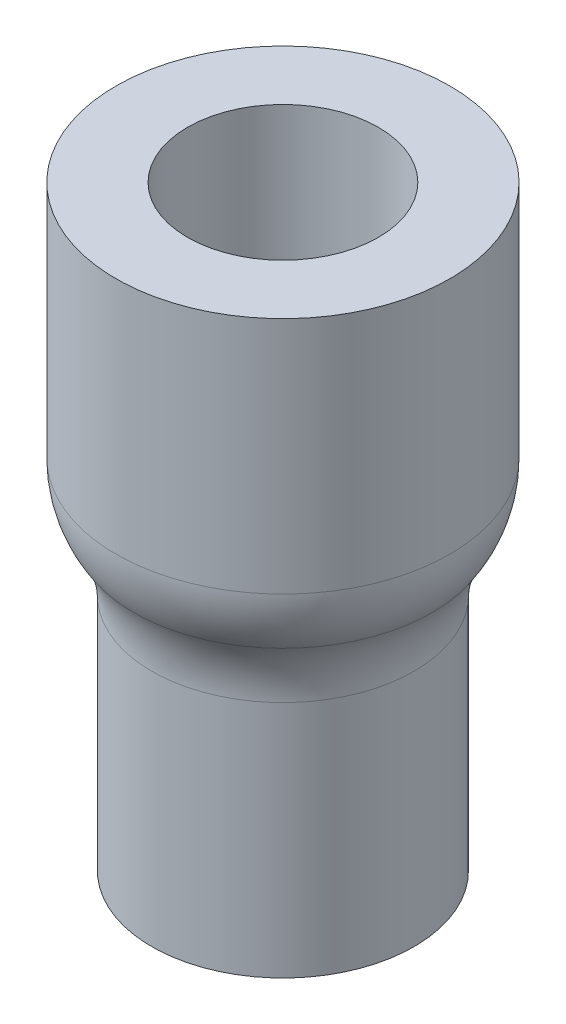
ISO-10303-21;
HEADER;
FILE_DESCRIPTION(('STEP AP214'),'2;1');
FILE_NAME('part.step','',(''),(''),'','','');
FILE_SCHEMA(('AUTOMOTIVE_DESIGN { 1 0 10303 214 1 1 1 1 }'));
ENDSEC;
DATA;
#1=APPLICATION_CONTEXT('core data for automotive mechanical design processes');
#2=APPLICATION_PROTOCOL_DEFINITION('international standard','automotive_design',2000,#1);
#3=PRODUCT_CONTEXT('',#1,'mechanical');
#4=PRODUCT('Part','Part','',(#3));
#5=PRODUCT_RELATED_PRODUCT_CATEGORY('part','',(#4));
#6=PRODUCT_DEFINITION_FORMATION('','',#4);
#7=PRODUCT_DEFINITION_CONTEXT('part definition',#1,'design');
#8=PRODUCT_DEFINITION('design','',#6,#7);
#9=PRODUCT_DEFINITION_SHAPE('','',#8);
#10=(LENGTH_UNIT() NAMED_UNIT(*) SI_UNIT(.MILLI.,.METRE.));
#11=(NAMED_UNIT(*) PLANE_ANGLE_UNIT() SI_UNIT($,.RADIAN.));
#12=(NAMED_UNIT(*) SI_UNIT($,.STERADIAN.) SOLID_ANGLE_UNIT());
#13=UNCERTAINTY_MEASURE_WITH_UNIT(LENGTH_MEASURE(1.E-05),#10,'distance_accuracy_value','');
#14=(GEOMETRIC_REPRESENTATION_CONTEXT(3) GLOBAL_UNCERTAINTY_ASSIGNED_CONTEXT((#13)) GLOBAL_UNIT_ASSIGNED_CONTEXT((#10,
#11,#12)) REPRESENTATION_CONTEXT('',''));
#15=CARTESIAN_POINT('',(0.,0.,0.));
#16=DIRECTION('',(0.,0.,1.));
#17=DIRECTION('',(1.,0.,0.));
#18=AXIS2_PLACEMENT_3D('',#15,#16,#17);
#19=CARTESIAN_POINT('',(5.5,0.,0.));
#20=DIRECTION('',(0.,-1.,0.));
#21=DIRECTION('',(0.,0.,-1.));
#22=AXIS2_PLACEMENT_3D('',#19,#20,#21);
#23=PLANE('',#22);
#24=CARTESIAN_POINT('',(0.,0.,0.));
#25=DIRECTION('',(0.,-1.,0.));
#26=DIRECTION('',(0.,0.,-1.));
#27=AXIS2_PLACEMENT_3D('',#24,#25,#26);
#28=CIRCLE('',#27,5.5);
#29=CARTESIAN_POINT('',(0.,0.,-5.5));
#30=VERTEX_POINT('',#29);
#31=EDGE_CURVE('E64',#30,#30,#28,.T.);
#32=ORIENTED_EDGE('',*,*,#31,.T.);
#33=EDGE_LOOP('',(#32));
#34=FACE_BOUND('',#33,.T.);
#35=CARTESIAN_POINT('',(0.,0.,0.));
#36=DIRECTION('',(0.,-1.,0.));
#37=DIRECTION('',(0.,0.,-1.));
#38=AXIS2_PLACEMENT_3D('',#35,#36,#37);
#39=CIRCLE('',#38,2.5);
#40=CARTESIAN_POINT('',(0.,0.,-2.5));
#41=VERTEX_POINT('',#40);
#42=EDGE_CURVE('E10',#41,#41,#39,.T.);
#43=ORIENTED_EDGE('',*,*,#42,.F.);
#44=EDGE_LOOP('',(#43));
#45=FACE_BOUND('',#44,.T.);
#46=ADVANCED_FACE('F30',(#34,#45),#23,.T.);
#47=CARTESIAN_POINT('',(0.,0.,0.));
#48=DIRECTION('',(0.,-1.,0.));
#49=DIRECTION('',(0.,0.,-1.));
#50=AXIS2_PLACEMENT_3D('',#47,#48,#49);
#51=CYLINDRICAL_SURFACE('',#50,2.5);
#52=ORIENTED_EDGE('',*,*,#42,.T.);
#53=EDGE_LOOP('',(#52));
#54=FACE_BOUND('',#53,.T.);
#55=CARTESIAN_POINT('',(0.,10.,0.));
#56=DIRECTION('',(0.,-1.,0.));
#57=DIRECTION('',(0.,0.,-1.));
#58=AXIS2_PLACEMENT_3D('',#55,#56,#57);
#59=CIRCLE('',#58,2.5);
#60=CARTESIAN_POINT('',(0.,10.,-2.5));
#61=VERTEX_POINT('',#60);
#62=EDGE_CURVE('E36',#61,#61,#59,.T.);
#63=ORIENTED_EDGE('',*,*,#62,.F.);
#64=EDGE_LOOP('',(#63));
#65=FACE_BOUND('',#64,.T.);
#66=ADVANCED_FACE('F82',(#54,#65),#51,.F.);
#67=CARTESIAN_POINT('',(0.,10.,0.));
#68=DIRECTION('',(0.,-1.,0.));
#69=DIRECTION('',(0.,0.,-1.));
#70=AXIS2_PLACEMENT_3D('',#67,#68,#69);
#71=TOROIDAL_SURFACE('',#70,7.04166666666667,4.54166666666667);
#72=ORIENTED_EDGE('',*,*,#62,.T.);
#73=EDGE_LOOP('',(#72));
#74=FACE_BOUND('',#73,.T.);
#75=CARTESIAN_POINT('',(0.,12.5,0.));
#76=DIRECTION('',(0.,-1.,0.));
#77=DIRECTION('',(0.,0.,-1.));
#78=AXIS2_PLACEMENT_3D('',#75,#76,#77);
#79=CIRCLE('',#78,3.25);
#80=CARTESIAN_POINT('',(0.,12.5,-3.25));
#81=VERTEX_POINT('',#80);
#82=EDGE_CURVE('E40',#81,#81,#79,.T.);
#83=ORIENTED_EDGE('',*,*,#82,.F.);
#84=EDGE_LOOP('',(#83));
#85=FACE_BOUND('',#84,.T.);
#86=ADVANCED_FACE('F86',(#74,#85),#71,.T.);
#87=CARTESIAN_POINT('',(0.,15.,0.));
#88=DIRECTION('',(0.,-1.,0.));
#89=DIRECTION('',(0.,0.,-1.));
#90=AXIS2_PLACEMENT_3D('',#87,#88,#89);
#91=DEGENERATE_TOROIDAL_SURFACE('',#90,0.541666666666671,4.54166666666667,.F.);
#92=ORIENTED_EDGE('',*,*,#82,.T.);
#93=EDGE_LOOP('',(#92));
#94=FACE_BOUND('',#93,.T.);
#95=CARTESIAN_POINT('',(0.,15.,0.));
#96=DIRECTION('',(0.,-1.,0.));
#97=DIRECTION('',(0.,0.,-1.));
#98=AXIS2_PLACEMENT_3D('',#95,#96,#97);
#99=CIRCLE('',#98,4.);
#100=CARTESIAN_POINT('',(0.,15.,-4.));
#101=VERTEX_POINT('',#100);
#102=EDGE_CURVE('E44',#101,#101,#99,.T.);
#103=ORIENTED_EDGE('',*,*,#102,.F.);
#104=EDGE_LOOP('',(#103));
#105=FACE_BOUND('',#104,.T.);
#106=ADVANCED_FACE('F90',(#94,#105),#91,.T.);
#107=CARTESIAN_POINT('',(0.,0.,0.));
#108=DIRECTION('',(0.,-1.,0.));
#109=DIRECTION('',(0.,0.,-1.));
#110=AXIS2_PLACEMENT_3D('',#107,#108,#109);
#111=CYLINDRICAL_SURFACE('',#110,4.);
#112=ORIENTED_EDGE('',*,*,#102,.T.);
#113=EDGE_LOOP('',(#112));
#114=FACE_BOUND('',#113,.T.);
#115=CARTESIAN_POINT('',(0.,25.,0.));
#116=DIRECTION('',(0.,-1.,0.));
#117=DIRECTION('',(0.,0.,-1.));
#118=AXIS2_PLACEMENT_3D('',#115,#116,#117);
#119=CIRCLE('',#118,4.);
#120=CARTESIAN_POINT('',(0.,25.,-4.));
#121=VERTEX_POINT('',#120);
#122=EDGE_CURVE('E49',#121,#121,#119,.T.);
#123=ORIENTED_EDGE('',*,*,#122,.F.);
#124=EDGE_LOOP('',(#123));
#125=FACE_BOUND('',#124,.T.);
#126=ADVANCED_FACE('F96',(#114,#125),#111,.F.);
#127=CARTESIAN_POINT('',(4.,25.,0.));
#128=DIRECTION('',(0.,1.,0.));
#129=DIRECTION('',(0.,0.,1.));
#130=AXIS2_PLACEMENT_3D('',#127,#128,#129);
#131=PLANE('',#130);
#132=ORIENTED_EDGE('',*,*,#122,.T.);
#133=EDGE_LOOP('',(#132));
#134=FACE_BOUND('',#133,.T.);
#135=CARTESIAN_POINT('',(0.,25.,0.));
#136=DIRECTION('',(0.,-1.,0.));
#137=DIRECTION('',(0.,0.,-1.));
#138=AXIS2_PLACEMENT_3D('',#135,#136,#137);
#139=CIRCLE('',#138,7.);
#140=CARTESIAN_POINT('',(0.,25.,-7.));
#141=VERTEX_POINT('',#140);
#142=EDGE_CURVE('E52',#141,#141,#139,.T.);
#143=ORIENTED_EDGE('',*,*,#142,.F.);
#144=EDGE_LOOP('',(#143));
#145=FACE_BOUND('',#144,.T.);
#146=ADVANCED_FACE('F100',(#134,#145),#131,.T.);
#147=CARTESIAN_POINT('',(0.,0.,0.));
#148=DIRECTION('',(0.,-1.,0.));
#149=DIRECTION('',(0.,0.,-1.));
#150=AXIS2_PLACEMENT_3D('',#147,#148,#149);
#151=CYLINDRICAL_SURFACE('',#150,7.);
#152=ORIENTED_EDGE('',*,*,#142,.T.);
#153=EDGE_LOOP('',(#152));
#154=FACE_BOUND('',#153,.T.);
#155=CARTESIAN_POINT('',(0.,15.,0.));
#156=DIRECTION('',(0.,-1.,0.));
#157=DIRECTION('',(0.,0.,-1.));
#158=AXIS2_PLACEMENT_3D('',#155,#156,#157);
#159=CIRCLE('',#158,7.);
#160=CARTESIAN_POINT('',(0.,15.,-7.));
#161=VERTEX_POINT('',#160);
#162=EDGE_CURVE('E55',#161,#161,#159,.T.);
#163=ORIENTED_EDGE('',*,*,#162,.F.);
#164=EDGE_LOOP('',(#163));
#165=FACE_BOUND('',#164,.T.);
#166=ADVANCED_FACE('F104',(#154,#165),#151,.T.);
#167=CARTESIAN_POINT('',(0.,15.,0.));
#168=DIRECTION('',(0.,-1.,0.));
#169=DIRECTION('',(0.,0.,-1.));
#170=AXIS2_PLACEMENT_3D('',#167,#168,#169);
#171=DEGENERATE_TOROIDAL_SURFACE('',#170,2.45833333333333,4.54166666666667,.T.);
#172=ORIENTED_EDGE('',*,*,#162,.T.);
#173=EDGE_LOOP('',(#172));
#174=FACE_BOUND('',#173,.T.);
#175=CARTESIAN_POINT('',(0.,12.5,0.));
#176=DIRECTION('',(0.,-1.,0.));
#177=DIRECTION('',(0.,0.,-1.));
#178=AXIS2_PLACEMENT_3D('',#175,#176,#177);
#179=CIRCLE('',#178,6.25);
#180=CARTESIAN_POINT('',(0.,12.5,-6.25));
#181=VERTEX_POINT('',#180);
#182=EDGE_CURVE('E58',#181,#181,#179,.T.);
#183=ORIENTED_EDGE('',*,*,#182,.F.);
#184=EDGE_LOOP('',(#183));
#185=FACE_BOUND('',#184,.T.);
#186=ADVANCED_FACE('F78',(#174,#185),#171,.T.);
#187=CARTESIAN_POINT('',(0.,10.,0.));
#188=DIRECTION('',(0.,-1.,0.));
#189=DIRECTION('',(0.,0.,-1.));
#190=AXIS2_PLACEMENT_3D('',#187,#188,#189);
#191=TOROIDAL_SURFACE('',#190,10.0416666666667,4.54166666666667);
#192=ORIENTED_EDGE('',*,*,#182,.T.);
#193=EDGE_LOOP('',(#192));
#194=FACE_BOUND('',#193,.T.);
#195=CARTESIAN_POINT('',(0.,10.,0.));
#196=DIRECTION('',(0.,-1.,0.));
#197=DIRECTION('',(0.,0.,-1.));
#198=AXIS2_PLACEMENT_3D('',#195,#196,#197);
#199=CIRCLE('',#198,5.5);
#200=CARTESIAN_POINT('',(0.,10.,-5.5));
#201=VERTEX_POINT('',#200);
#202=EDGE_CURVE('E61',#201,#201,#199,.T.);
#203=ORIENTED_EDGE('',*,*,#202,.F.);
#204=EDGE_LOOP('',(#203));
#205=FACE_BOUND('',#204,.T.);
#206=ADVANCED_FACE('F72',(#194,#205),#191,.F.);
#207=CARTESIAN_POINT('',(0.,0.,0.));
#208=DIRECTION('',(0.,-1.,0.));
#209=DIRECTION('',(0.,0.,-1.));
#210=AXIS2_PLACEMENT_3D('',#207,#208,#209);
#211=CYLINDRICAL_SURFACE('',#210,5.5);
#212=ORIENTED_EDGE('',*,*,#202,.T.);
#213=EDGE_LOOP('',(#212));
#214=FACE_BOUND('',#213,.T.);
#215=ORIENTED_EDGE('',*,*,#31,.F.);
#216=EDGE_LOOP('',(#215));
#217=FACE_BOUND('',#216,.T.);
#218=ADVANCED_FACE('F70',(#214,#217),#211,.T.);
#219=CLOSED_SHELL('',(#46,#66,#86,#106,#126,#146,#166,#186,#206,#218));
#220=MANIFOLD_SOLID_BREP('B2',#219);
#221=ADVANCED_BREP_SHAPE_REPRESENTATION('',(#18,#220),#14);
#222=SHAPE_DEFINITION_REPRESENTATION(#9,#221);
ENDSEC;
END-ISO-10303-21;
